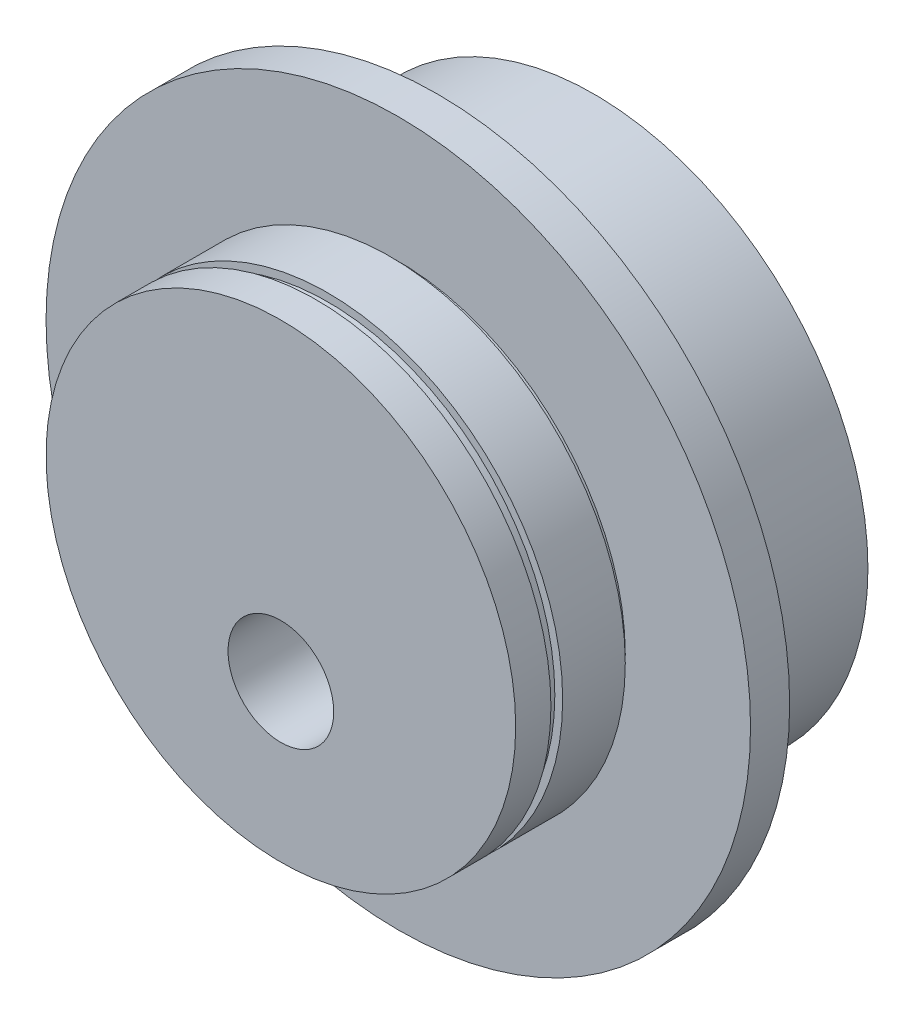
ISO-10303-21;
HEADER;
FILE_DESCRIPTION(('STEP AP214'),'2;1');
FILE_NAME('part.step','',(''),(''),'','','');
FILE_SCHEMA(('AUTOMOTIVE_DESIGN { 1 0 10303 214 1 1 1 1 }'));
ENDSEC;
DATA;
#1=APPLICATION_CONTEXT('core data for automotive mechanical design processes');
#2=APPLICATION_PROTOCOL_DEFINITION('international standard','automotive_design',2000,#1);
#3=PRODUCT_CONTEXT('',#1,'mechanical');
#4=PRODUCT('Part','Part','',(#3));
#5=PRODUCT_RELATED_PRODUCT_CATEGORY('part','',(#4));
#6=PRODUCT_DEFINITION_FORMATION('','',#4);
#7=PRODUCT_DEFINITION_CONTEXT('part definition',#1,'design');
#8=PRODUCT_DEFINITION('design','',#6,#7);
#9=PRODUCT_DEFINITION_SHAPE('','',#8);
#10=(LENGTH_UNIT() NAMED_UNIT(*) SI_UNIT(.MILLI.,.METRE.));
#11=(NAMED_UNIT(*) PLANE_ANGLE_UNIT() SI_UNIT($,.RADIAN.));
#12=(NAMED_UNIT(*) SI_UNIT($,.STERADIAN.) SOLID_ANGLE_UNIT());
#13=UNCERTAINTY_MEASURE_WITH_UNIT(LENGTH_MEASURE(1.E-05),#10,'distance_accuracy_value','');
#14=(GEOMETRIC_REPRESENTATION_CONTEXT(3) GLOBAL_UNCERTAINTY_ASSIGNED_CONTEXT((#13)) GLOBAL_UNIT_ASSIGNED_CONTEXT((#10,
#11,#12)) REPRESENTATION_CONTEXT('',''));
#15=CARTESIAN_POINT('',(0.,0.,0.));
#16=DIRECTION('',(0.,0.,1.));
#17=DIRECTION('',(1.,0.,0.));
#18=AXIS2_PLACEMENT_3D('',#15,#16,#17);
#19=CARTESIAN_POINT('',(0.,0.,50.8));
#20=DIRECTION('',(0.,0.,-1.));
#21=DIRECTION('',(-1.,0.,0.));
#22=AXIS2_PLACEMENT_3D('',#19,#20,#21);
#23=CYLINDRICAL_SURFACE('',#22,36.83);
#24=CARTESIAN_POINT('',(0.,1.66533453693773E-13,31.75));
#25=DIRECTION('',(0.,0.,1.));
#26=DIRECTION('',(1.,0.,0.));
#27=AXIS2_PLACEMENT_3D('',#24,#25,#26);
#28=CIRCLE('',#27,36.83);
#29=CARTESIAN_POINT('',(36.83,1.66533453693773E-13,31.75));
#30=VERTEX_POINT('',#29);
#31=EDGE_CURVE('E36',#30,#30,#28,.T.);
#32=ORIENTED_EDGE('',*,*,#31,.T.);
#33=EDGE_LOOP('',(#32));
#34=FACE_BOUND('',#33,.T.);
#35=CARTESIAN_POINT('',(0.,1.66533453693773E-13,33.02));
#36=DIRECTION('',(0.,0.,1.));
#37=DIRECTION('',(1.,0.,0.));
#38=AXIS2_PLACEMENT_3D('',#35,#36,#37);
#39=CIRCLE('',#38,36.83);
#40=CARTESIAN_POINT('',(36.83,1.66533453693773E-13,33.02));
#41=VERTEX_POINT('',#40);
#42=EDGE_CURVE('E10',#41,#41,#39,.T.);
#43=ORIENTED_EDGE('',*,*,#42,.F.);
#44=EDGE_LOOP('',(#43));
#45=FACE_BOUND('',#44,.T.);
#46=ADVANCED_FACE('F32',(#34,#45),#23,.T.);
#47=CARTESIAN_POINT('',(0.,0.,43.18));
#48=DIRECTION('',(0.,0.,-1.));
#49=DIRECTION('',(-1.,0.,0.));
#50=AXIS2_PLACEMENT_3D('',#47,#48,#49);
#51=CYLINDRICAL_SURFACE('',#50,38.1);
#52=CARTESIAN_POINT('',(0.,0.,43.18));
#53=DIRECTION('',(0.,0.,1.));
#54=DIRECTION('',(1.,0.,0.));
#55=AXIS2_PLACEMENT_3D('',#52,#53,#54);
#56=CIRCLE('',#55,38.1);
#57=CARTESIAN_POINT('',(38.1,0.,43.18));
#58=VERTEX_POINT('',#57);
#59=EDGE_CURVE('E51',#58,#58,#56,.T.);
#60=ORIENTED_EDGE('',*,*,#59,.F.);
#61=EDGE_LOOP('',(#60));
#62=FACE_BOUND('',#61,.T.);
#63=CARTESIAN_POINT('',(0.,1.66533453693773E-13,33.02));
#64=DIRECTION('',(0.,0.,1.));
#65=DIRECTION('',(1.,0.,0.));
#66=AXIS2_PLACEMENT_3D('',#63,#64,#65);
#67=CIRCLE('',#66,38.1);
#68=CARTESIAN_POINT('',(38.1,1.66533453693773E-13,33.02));
#69=VERTEX_POINT('',#68);
#70=EDGE_CURVE('E58',#69,#69,#67,.T.);
#71=ORIENTED_EDGE('',*,*,#70,.T.);
#72=EDGE_LOOP('',(#71));
#73=FACE_BOUND('',#72,.T.);
#74=ADVANCED_FACE('F92',(#62,#73),#51,.T.);
#75=CARTESIAN_POINT('',(0.,0.,43.18));
#76=DIRECTION('',(0.,0.,1.));
#77=DIRECTION('',(1.,0.,0.));
#78=AXIS2_PLACEMENT_3D('',#75,#76,#77);
#79=PLANE('',#78);
#80=CARTESIAN_POINT('',(0.,0.,43.18));
#81=DIRECTION('',(0.,0.,1.));
#82=DIRECTION('',(1.,0.,0.));
#83=AXIS2_PLACEMENT_3D('',#80,#81,#82);
#84=CIRCLE('',#83,36.83);
#85=CARTESIAN_POINT('',(36.83,0.,43.18));
#86=VERTEX_POINT('',#85);
#87=EDGE_CURVE('E48',#86,#86,#84,.T.);
#88=ORIENTED_EDGE('',*,*,#87,.F.);
#89=EDGE_LOOP('',(#88));
#90=FACE_BOUND('',#89,.T.);
#91=ORIENTED_EDGE('',*,*,#59,.T.);
#92=EDGE_LOOP('',(#91));
#93=FACE_BOUND('',#92,.T.);
#94=ADVANCED_FACE('F98',(#90,#93),#79,.T.);
#95=CARTESIAN_POINT('',(0.,1.66533453693773E-13,33.02));
#96=DIRECTION('',(0.,0.,1.));
#97=DIRECTION('',(1.,0.,0.));
#98=AXIS2_PLACEMENT_3D('',#95,#96,#97);
#99=PLANE('',#98);
#100=ORIENTED_EDGE('',*,*,#42,.T.);
#101=EDGE_LOOP('',(#100));
#102=FACE_BOUND('',#101,.T.);
#103=ORIENTED_EDGE('',*,*,#70,.F.);
#104=EDGE_LOOP('',(#103));
#105=FACE_BOUND('',#104,.T.);
#106=ADVANCED_FACE('F128',(#102,#105),#99,.F.);
#107=CARTESIAN_POINT('',(0.,0.,50.8));
#108=DIRECTION('',(0.,0.,1.));
#109=DIRECTION('',(1.,0.,0.));
#110=AXIS2_PLACEMENT_3D('',#107,#108,#109);
#111=PLANE('',#110);
#112=CARTESIAN_POINT('',(1.66533453693773E-13,-12.7,50.8000000000001));
#113=DIRECTION('',(0.,0.,1.));
#114=DIRECTION('',(1.,0.,0.));
#115=AXIS2_PLACEMENT_3D('',#112,#113,#114);
#116=CIRCLE('',#115,8.5725);
#117=CARTESIAN_POINT('',(8.57250000000017,-12.7,50.8000000000001));
#118=VERTEX_POINT('',#117);
#119=EDGE_CURVE('E148',#118,#118,#116,.T.);
#120=ORIENTED_EDGE('',*,*,#119,.F.);
#121=EDGE_LOOP('',(#120));
#122=FACE_BOUND('',#121,.T.);
#123=CARTESIAN_POINT('',(0.,0.,50.8));
#124=DIRECTION('',(0.,0.,1.));
#125=DIRECTION('',(1.,0.,0.));
#126=AXIS2_PLACEMENT_3D('',#123,#124,#125);
#127=CIRCLE('',#126,38.1);
#128=CARTESIAN_POINT('',(38.1,0.,50.8));
#129=VERTEX_POINT('',#128);
#130=EDGE_CURVE('E50',#129,#129,#127,.T.);
#131=ORIENTED_EDGE('',*,*,#130,.T.);
#132=EDGE_LOOP('',(#131));
#133=FACE_BOUND('',#132,.T.);
#134=ADVANCED_FACE('F123',(#122,#133),#111,.T.);
#135=CARTESIAN_POINT('',(0.,0.,45.085));
#136=DIRECTION('',(0.,0.,1.));
#137=DIRECTION('',(1.,0.,0.));
#138=AXIS2_PLACEMENT_3D('',#135,#136,#137);
#139=CYLINDRICAL_SURFACE('',#138,38.1);
#140=CARTESIAN_POINT('',(0.,0.,45.085));
#141=DIRECTION('',(0.,0.,1.));
#142=DIRECTION('',(1.,0.,0.));
#143=AXIS2_PLACEMENT_3D('',#140,#141,#142);
#144=CIRCLE('',#143,38.1);
#145=CARTESIAN_POINT('',(38.1,0.,45.085));
#146=VERTEX_POINT('',#145);
#147=EDGE_CURVE('E55',#146,#146,#144,.T.);
#148=ORIENTED_EDGE('',*,*,#147,.T.);
#149=EDGE_LOOP('',(#148));
#150=FACE_BOUND('',#149,.T.);
#151=ORIENTED_EDGE('',*,*,#130,.F.);
#152=EDGE_LOOP('',(#151));
#153=FACE_BOUND('',#152,.T.);
#154=ADVANCED_FACE('F113',(#150,#153),#139,.T.);
#155=CARTESIAN_POINT('',(0.,0.,45.085));
#156=DIRECTION('',(0.,0.,1.));
#157=DIRECTION('',(1.,0.,0.));
#158=AXIS2_PLACEMENT_3D('',#155,#156,#157);
#159=PLANE('',#158);
#160=CARTESIAN_POINT('',(0.,0.,45.085));
#161=DIRECTION('',(0.,0.,1.));
#162=DIRECTION('',(1.,0.,0.));
#163=AXIS2_PLACEMENT_3D('',#160,#161,#162);
#164=CIRCLE('',#163,36.83);
#165=CARTESIAN_POINT('',(36.83,0.,45.085));
#166=VERTEX_POINT('',#165);
#167=EDGE_CURVE('E40',#166,#166,#164,.T.);
#168=ORIENTED_EDGE('',*,*,#167,.T.);
#169=EDGE_LOOP('',(#168));
#170=FACE_BOUND('',#169,.T.);
#171=ORIENTED_EDGE('',*,*,#147,.F.);
#172=EDGE_LOOP('',(#171));
#173=FACE_BOUND('',#172,.T.);
#174=ADVANCED_FACE('F106',(#170,#173),#159,.F.);
#175=ORIENTED_EDGE('',*,*,#87,.T.);
#176=EDGE_LOOP('',(#175));
#177=FACE_BOUND('',#176,.T.);
#178=ORIENTED_EDGE('',*,*,#167,.F.);
#179=EDGE_LOOP('',(#178));
#180=FACE_BOUND('',#179,.T.);
#181=ADVANCED_FACE('F94',(#177,#180),#23,.T.);
#182=CARTESIAN_POINT('',(0.,1.66533453693773E-13,31.75));
#183=DIRECTION('',(0.,0.,-1.));
#184=DIRECTION('',(-1.,0.,0.));
#185=AXIS2_PLACEMENT_3D('',#182,#183,#184);
#186=CYLINDRICAL_SURFACE('',#185,57.15);
#187=CARTESIAN_POINT('',(0.,1.66533453693773E-13,31.75));
#188=DIRECTION('',(0.,0.,1.));
#189=DIRECTION('',(1.,0.,0.));
#190=AXIS2_PLACEMENT_3D('',#187,#188,#189);
#191=CIRCLE('',#190,57.15);
#192=CARTESIAN_POINT('',(57.15,1.66533453693773E-13,31.75));
#193=VERTEX_POINT('',#192);
#194=EDGE_CURVE('E153',#193,#193,#191,.T.);
#195=ORIENTED_EDGE('',*,*,#194,.F.);
#196=EDGE_LOOP('',(#195));
#197=FACE_BOUND('',#196,.T.);
#198=CARTESIAN_POINT('',(0.,1.66533453693773E-13,25.4));
#199=DIRECTION('',(0.,0.,1.));
#200=DIRECTION('',(1.,0.,0.));
#201=AXIS2_PLACEMENT_3D('',#198,#199,#200);
#202=CIRCLE('',#201,57.15);
#203=CARTESIAN_POINT('',(57.1500000000001,1.66533453693773E-13,25.4));
#204=VERTEX_POINT('',#203);
#205=EDGE_CURVE('E65',#204,#204,#202,.T.);
#206=ORIENTED_EDGE('',*,*,#205,.T.);
#207=EDGE_LOOP('',(#206));
#208=FACE_BOUND('',#207,.T.);
#209=ADVANCED_FACE('F105',(#197,#208),#186,.T.);
#210=CARTESIAN_POINT('',(0.,1.66533453693773E-13,31.75));
#211=DIRECTION('',(0.,0.,1.));
#212=DIRECTION('',(1.,0.,0.));
#213=AXIS2_PLACEMENT_3D('',#210,#211,#212);
#214=PLANE('',#213);
#215=ORIENTED_EDGE('',*,*,#31,.F.);
#216=EDGE_LOOP('',(#215));
#217=FACE_BOUND('',#216,.T.);
#218=ORIENTED_EDGE('',*,*,#194,.T.);
#219=EDGE_LOOP('',(#218));
#220=FACE_BOUND('',#219,.T.);
#221=ADVANCED_FACE('F86',(#217,#220),#214,.T.);
#222=CARTESIAN_POINT('',(0.,1.66533453693773E-13,25.4));
#223=DIRECTION('',(0.,0.,1.));
#224=DIRECTION('',(1.,0.,0.));
#225=AXIS2_PLACEMENT_3D('',#222,#223,#224);
#226=PLANE('',#225);
#227=CARTESIAN_POINT('',(0.,1.66533453693773E-13,25.4));
#228=DIRECTION('',(0.,0.,1.));
#229=DIRECTION('',(1.,0.,0.));
#230=AXIS2_PLACEMENT_3D('',#227,#228,#229);
#231=CIRCLE('',#230,44.45);
#232=CARTESIAN_POINT('',(44.45,1.66533453693773E-13,25.4));
#233=VERTEX_POINT('',#232);
#234=EDGE_CURVE('E45',#233,#233,#231,.T.);
#235=ORIENTED_EDGE('',*,*,#234,.T.);
#236=EDGE_LOOP('',(#235));
#237=FACE_BOUND('',#236,.T.);
#238=ORIENTED_EDGE('',*,*,#205,.F.);
#239=EDGE_LOOP('',(#238));
#240=FACE_BOUND('',#239,.T.);
#241=ADVANCED_FACE('F78',(#237,#240),#226,.F.);
#242=CARTESIAN_POINT('',(0.,0.,0.));
#243=DIRECTION('',(0.,0.,1.));
#244=DIRECTION('',(1.,0.,0.));
#245=AXIS2_PLACEMENT_3D('',#242,#243,#244);
#246=PLANE('',#245);
#247=CARTESIAN_POINT('',(0.,-12.7,0.));
#248=DIRECTION('',(0.,0.,1.));
#249=DIRECTION('',(1.,0.,0.));
#250=AXIS2_PLACEMENT_3D('',#247,#248,#249);
#251=CIRCLE('',#250,8.5725);
#252=CARTESIAN_POINT('',(8.5725,-12.7,0.));
#253=VERTEX_POINT('',#252);
#254=EDGE_CURVE('E150',#253,#253,#251,.T.);
#255=ORIENTED_EDGE('',*,*,#254,.T.);
#256=EDGE_LOOP('',(#255));
#257=FACE_BOUND('',#256,.T.);
#258=CARTESIAN_POINT('',(0.,0.,0.));
#259=DIRECTION('',(0.,0.,1.));
#260=DIRECTION('',(1.,0.,0.));
#261=AXIS2_PLACEMENT_3D('',#258,#259,#260);
#262=CIRCLE('',#261,44.45);
#263=CARTESIAN_POINT('',(44.45,0.,0.));
#264=VERTEX_POINT('',#263);
#265=EDGE_CURVE('E69',#264,#264,#262,.T.);
#266=ORIENTED_EDGE('',*,*,#265,.F.);
#267=EDGE_LOOP('',(#266));
#268=FACE_BOUND('',#267,.T.);
#269=ADVANCED_FACE('F76',(#257,#268),#246,.F.);
#270=CARTESIAN_POINT('',(0.,1.66533453693773E-13,25.4));
#271=DIRECTION('',(0.,0.,-1.));
#272=DIRECTION('',(-1.,0.,0.));
#273=AXIS2_PLACEMENT_3D('',#270,#271,#272);
#274=CYLINDRICAL_SURFACE('',#273,44.45);
#275=ORIENTED_EDGE('',*,*,#234,.F.);
#276=EDGE_LOOP('',(#275));
#277=FACE_BOUND('',#276,.T.);
#278=ORIENTED_EDGE('',*,*,#265,.T.);
#279=EDGE_LOOP('',(#278));
#280=FACE_BOUND('',#279,.T.);
#281=ADVANCED_FACE('F34',(#277,#280),#274,.T.);
#282=CARTESIAN_POINT('',(0.,-12.7,0.));
#283=DIRECTION('',(0.,0.,1.));
#284=DIRECTION('',(1.,0.,0.));
#285=AXIS2_PLACEMENT_3D('',#282,#283,#284);
#286=CYLINDRICAL_SURFACE('',#285,8.5725);
#287=ORIENTED_EDGE('',*,*,#119,.T.);
#288=EDGE_LOOP('',(#287));
#289=FACE_BOUND('',#288,.T.);
#290=ORIENTED_EDGE('',*,*,#254,.F.);
#291=EDGE_LOOP('',(#290));
#292=FACE_BOUND('',#291,.T.);
#293=ADVANCED_FACE('F84',(#289,#292),#286,.F.);
#294=CLOSED_SHELL('',(#46,#74,#94,#106,#134,#154,#174,#181,#209,#221,#241,#269,#281,#293));
#295=MANIFOLD_SOLID_BREP('B2',#294);
#296=ADVANCED_BREP_SHAPE_REPRESENTATION('',(#18,#295),#14);
#297=SHAPE_DEFINITION_REPRESENTATION(#9,#296);
ENDSEC;
END-ISO-10303-21;
